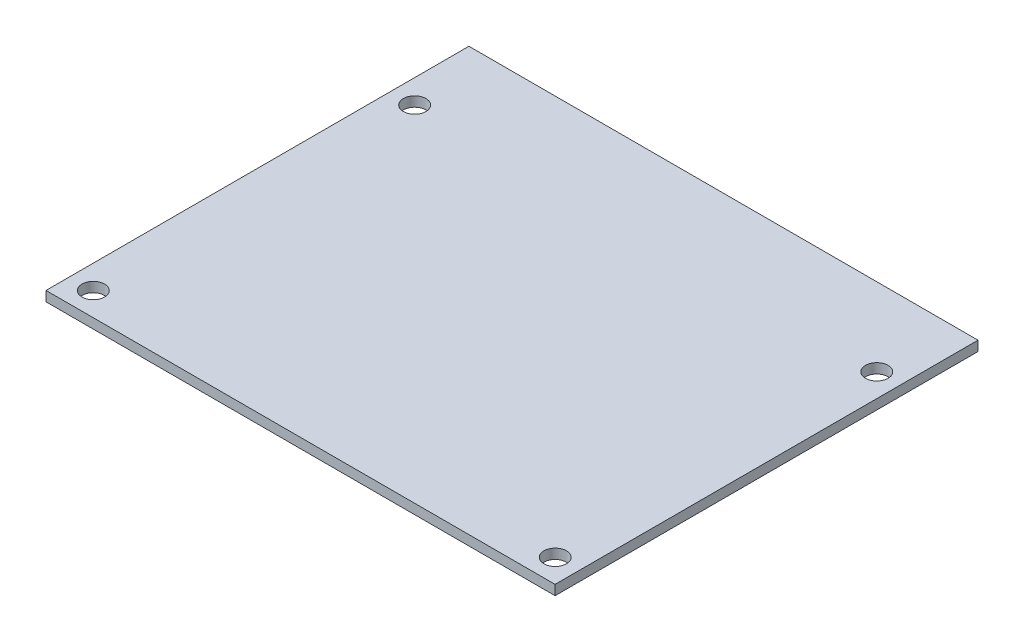
ISO-10303-21;
HEADER;
FILE_DESCRIPTION(('STEP AP214'),'2;1');
FILE_NAME('part.step','',(''),(''),'','','');
FILE_SCHEMA(('AUTOMOTIVE_DESIGN { 1 0 10303 214 1 1 1 1 }'));
ENDSEC;
DATA;
#1=APPLICATION_CONTEXT('core data for automotive mechanical design processes');
#2=APPLICATION_PROTOCOL_DEFINITION('international standard','automotive_design',2000,#1);
#3=PRODUCT_CONTEXT('',#1,'mechanical');
#4=PRODUCT('Part','Part','',(#3));
#5=PRODUCT_RELATED_PRODUCT_CATEGORY('part','',(#4));
#6=PRODUCT_DEFINITION_FORMATION('','',#4);
#7=PRODUCT_DEFINITION_CONTEXT('part definition',#1,'design');
#8=PRODUCT_DEFINITION('design','',#6,#7);
#9=PRODUCT_DEFINITION_SHAPE('','',#8);
#10=(LENGTH_UNIT() NAMED_UNIT(*) SI_UNIT(.MILLI.,.METRE.));
#11=(NAMED_UNIT(*) PLANE_ANGLE_UNIT() SI_UNIT($,.RADIAN.));
#12=(NAMED_UNIT(*) SI_UNIT($,.STERADIAN.) SOLID_ANGLE_UNIT());
#13=UNCERTAINTY_MEASURE_WITH_UNIT(LENGTH_MEASURE(1.E-05),#10,'distance_accuracy_value','');
#14=(GEOMETRIC_REPRESENTATION_CONTEXT(3) GLOBAL_UNCERTAINTY_ASSIGNED_CONTEXT((#13)) GLOBAL_UNIT_ASSIGNED_CONTEXT((#10,
#11,#12)) REPRESENTATION_CONTEXT('',''));
#15=CARTESIAN_POINT('',(0.,0.,0.));
#16=DIRECTION('',(0.,0.,1.));
#17=DIRECTION('',(1.,0.,0.));
#18=AXIS2_PLACEMENT_3D('',#15,#16,#17);
#19=CARTESIAN_POINT('',(41.275,1.6002,-34.29));
#20=DIRECTION('',(-1.,0.,0.));
#21=DIRECTION('',(0.,0.,1.));
#22=AXIS2_PLACEMENT_3D('',#19,#20,#21);
#23=PLANE('',#22);
#24=DIRECTION('',(0.,0.,-1.));
#25=VECTOR('',#24,1.);
#26=CARTESIAN_POINT('',(41.275,0.,-34.29));
#27=LINE('',#26,#25);
#28=CARTESIAN_POINT('',(41.275,0.,34.29));
#29=VERTEX_POINT('',#28);
#30=CARTESIAN_POINT('',(41.275,0.,-34.29));
#31=VERTEX_POINT('',#30);
#32=EDGE_CURVE('E100',#29,#31,#27,.T.);
#33=ORIENTED_EDGE('',*,*,#32,.T.);
#34=DIRECTION('',(0.,-1.,0.));
#35=VECTOR('',#34,1.);
#36=CARTESIAN_POINT('',(41.275,1.6002,-34.29));
#37=LINE('',#36,#35);
#38=CARTESIAN_POINT('',(41.275,1.6002,-34.29));
#39=VERTEX_POINT('',#38);
#40=EDGE_CURVE('E11',#39,#31,#37,.T.);
#41=ORIENTED_EDGE('',*,*,#40,.F.);
#42=DIRECTION('',(0.,0.,-1.));
#43=VECTOR('',#42,1.);
#44=CARTESIAN_POINT('',(41.275,1.6002,-34.29));
#45=LINE('',#44,#43);
#46=CARTESIAN_POINT('',(41.275,1.6002,34.29));
#47=VERTEX_POINT('',#46);
#48=EDGE_CURVE('E88',#47,#39,#45,.T.);
#49=ORIENTED_EDGE('',*,*,#48,.F.);
#50=DIRECTION('',(0.,-1.,0.));
#51=VECTOR('',#50,1.);
#52=CARTESIAN_POINT('',(41.275,1.6002,34.29));
#53=LINE('',#52,#51);
#54=EDGE_CURVE('E96',#47,#29,#53,.T.);
#55=ORIENTED_EDGE('',*,*,#54,.T.);
#56=EDGE_LOOP('',(#33,#41,#49,#55));
#57=FACE_BOUND('',#56,.T.);
#58=ADVANCED_FACE('F37',(#57),#23,.F.);
#59=CARTESIAN_POINT('',(-41.275,1.6002,-34.29));
#60=DIRECTION('',(0.,0.,1.));
#61=DIRECTION('',(1.,0.,0.));
#62=AXIS2_PLACEMENT_3D('',#59,#60,#61);
#63=PLANE('',#62);
#64=DIRECTION('',(-1.,0.,0.));
#65=VECTOR('',#64,1.);
#66=CARTESIAN_POINT('',(-41.275,0.,-34.29));
#67=LINE('',#66,#65);
#68=CARTESIAN_POINT('',(-41.275,0.,-34.29));
#69=VERTEX_POINT('',#68);
#70=EDGE_CURVE('E92',#31,#69,#67,.T.);
#71=ORIENTED_EDGE('',*,*,#70,.T.);
#72=DIRECTION('',(0.,-1.,0.));
#73=VECTOR('',#72,1.);
#74=CARTESIAN_POINT('',(-41.275,1.6002,-34.29));
#75=LINE('',#74,#73);
#76=CARTESIAN_POINT('',(-41.275,1.6002,-34.29));
#77=VERTEX_POINT('',#76);
#78=EDGE_CURVE('E45',#77,#69,#75,.T.);
#79=ORIENTED_EDGE('',*,*,#78,.F.);
#80=DIRECTION('',(-1.,0.,0.));
#81=VECTOR('',#80,1.);
#82=CARTESIAN_POINT('',(-41.275,1.6002,-34.29));
#83=LINE('',#82,#81);
#84=EDGE_CURVE('E83',#39,#77,#83,.T.);
#85=ORIENTED_EDGE('',*,*,#84,.F.);
#86=ORIENTED_EDGE('',*,*,#40,.T.);
#87=EDGE_LOOP('',(#71,#79,#85,#86));
#88=FACE_BOUND('',#87,.T.);
#89=ADVANCED_FACE('F91',(#88),#63,.F.);
#90=CARTESIAN_POINT('',(-41.275,1.6002,-34.29));
#91=DIRECTION('',(1.,0.,0.));
#92=DIRECTION('',(0.,0.,-1.));
#93=AXIS2_PLACEMENT_3D('',#90,#91,#92);
#94=PLANE('',#93);
#95=DIRECTION('',(0.,0.,1.));
#96=VECTOR('',#95,1.);
#97=CARTESIAN_POINT('',(-41.275,0.,-34.29));
#98=LINE('',#97,#96);
#99=CARTESIAN_POINT('',(-41.275,0.,34.29));
#100=VERTEX_POINT('',#99);
#101=EDGE_CURVE('E70',#69,#100,#98,.T.);
#102=ORIENTED_EDGE('',*,*,#101,.T.);
#103=DIRECTION('',(0.,-1.,0.));
#104=VECTOR('',#103,1.);
#105=CARTESIAN_POINT('',(-41.275,1.6002,34.29));
#106=LINE('',#105,#104);
#107=CARTESIAN_POINT('',(-41.275,1.6002,34.29));
#108=VERTEX_POINT('',#107);
#109=EDGE_CURVE('E93',#108,#100,#106,.T.);
#110=ORIENTED_EDGE('',*,*,#109,.F.);
#111=DIRECTION('',(0.,0.,1.));
#112=VECTOR('',#111,1.);
#113=CARTESIAN_POINT('',(-41.275,1.6002,-34.29));
#114=LINE('',#113,#112);
#115=EDGE_CURVE('E86',#77,#108,#114,.T.);
#116=ORIENTED_EDGE('',*,*,#115,.F.);
#117=ORIENTED_EDGE('',*,*,#78,.T.);
#118=EDGE_LOOP('',(#102,#110,#116,#117));
#119=FACE_BOUND('',#118,.T.);
#120=ADVANCED_FACE('F94',(#119),#94,.F.);
#121=CARTESIAN_POINT('',(-41.275,1.6002,34.29));
#122=DIRECTION('',(0.,0.,-1.));
#123=DIRECTION('',(-1.,0.,0.));
#124=AXIS2_PLACEMENT_3D('',#121,#122,#123);
#125=PLANE('',#124);
#126=DIRECTION('',(1.,0.,0.));
#127=VECTOR('',#126,1.);
#128=CARTESIAN_POINT('',(-41.275,0.,34.29));
#129=LINE('',#128,#127);
#130=EDGE_CURVE('E76',#100,#29,#129,.T.);
#131=ORIENTED_EDGE('',*,*,#130,.T.);
#132=ORIENTED_EDGE('',*,*,#54,.F.);
#133=DIRECTION('',(1.,0.,0.));
#134=VECTOR('',#133,1.);
#135=CARTESIAN_POINT('',(-41.275,1.6002,34.29));
#136=LINE('',#135,#134);
#137=EDGE_CURVE('E53',#108,#47,#136,.T.);
#138=ORIENTED_EDGE('',*,*,#137,.F.);
#139=ORIENTED_EDGE('',*,*,#109,.T.);
#140=EDGE_LOOP('',(#131,#132,#138,#139));
#141=FACE_BOUND('',#140,.T.);
#142=ADVANCED_FACE('F108',(#141),#125,.F.);
#143=CARTESIAN_POINT('',(0.,1.6002,0.));
#144=DIRECTION('',(0.,1.,0.));
#145=DIRECTION('',(0.,0.,1.));
#146=AXIS2_PLACEMENT_3D('',#143,#144,#145);
#147=PLANE('',#146);
#148=CARTESIAN_POINT('',(-37.4223549376644,1.6002,30.4698986613374));
#149=DIRECTION('',(0.,1.,0.));
#150=DIRECTION('',(0.,0.,1.));
#151=AXIS2_PLACEMENT_3D('',#148,#149,#150);
#152=CIRCLE('',#151,1.8288);
#153=CARTESIAN_POINT('',(-37.4223549376644,1.6002,32.2986986613374));
#154=VERTEX_POINT('',#153);
#155=EDGE_CURVE('E132',#154,#154,#152,.T.);
#156=ORIENTED_EDGE('',*,*,#155,.F.);
#157=EDGE_LOOP('',(#156));
#158=FACE_BOUND('',#157,.T.);
#159=CARTESIAN_POINT('',(-37.4223549376644,1.6002,-21.6352322251794));
#160=DIRECTION('',(0.,1.,0.));
#161=DIRECTION('',(0.,0.,1.));
#162=AXIS2_PLACEMENT_3D('',#159,#160,#161);
#163=CIRCLE('',#162,1.8288);
#164=CARTESIAN_POINT('',(-37.4223549376644,1.6002,-19.8064322251794));
#165=VERTEX_POINT('',#164);
#166=EDGE_CURVE('E126',#165,#165,#163,.T.);
#167=ORIENTED_EDGE('',*,*,#166,.F.);
#168=EDGE_LOOP('',(#167));
#169=FACE_BOUND('',#168,.T.);
#170=CARTESIAN_POINT('',(37.5134275848108,1.6002,-21.6352322251794));
#171=DIRECTION('',(0.,1.,0.));
#172=DIRECTION('',(0.,0.,1.));
#173=AXIS2_PLACEMENT_3D('',#170,#171,#172);
#174=CIRCLE('',#173,1.8288);
#175=CARTESIAN_POINT('',(37.5134275848108,1.6002,-19.8064322251794));
#176=VERTEX_POINT('',#175);
#177=EDGE_CURVE('E120',#176,#176,#174,.T.);
#178=ORIENTED_EDGE('',*,*,#177,.F.);
#179=EDGE_LOOP('',(#178));
#180=FACE_BOUND('',#179,.T.);
#181=CARTESIAN_POINT('',(37.4881896451171,1.6002,30.4836627554579));
#182=DIRECTION('',(0.,1.,0.));
#183=DIRECTION('',(0.,0.,1.));
#184=AXIS2_PLACEMENT_3D('',#181,#182,#183);
#185=CIRCLE('',#184,1.8288);
#186=CARTESIAN_POINT('',(37.4881896451171,1.6002,32.3124627554579));
#187=VERTEX_POINT('',#186);
#188=EDGE_CURVE('E114',#187,#187,#185,.T.);
#189=ORIENTED_EDGE('',*,*,#188,.F.);
#190=EDGE_LOOP('',(#189));
#191=FACE_BOUND('',#190,.T.);
#192=ORIENTED_EDGE('',*,*,#48,.T.);
#193=ORIENTED_EDGE('',*,*,#84,.T.);
#194=ORIENTED_EDGE('',*,*,#115,.T.);
#195=ORIENTED_EDGE('',*,*,#137,.T.);
#196=EDGE_LOOP('',(#192,#193,#194,#195));
#197=FACE_BOUND('',#196,.T.);
#198=ADVANCED_FACE('F84',(#158,#169,#180,#191,#197),#147,.T.);
#199=CARTESIAN_POINT('',(0.,0.,0.));
#200=DIRECTION('',(0.,1.,0.));
#201=DIRECTION('',(0.,0.,1.));
#202=AXIS2_PLACEMENT_3D('',#199,#200,#201);
#203=PLANE('',#202);
#204=CARTESIAN_POINT('',(-37.4223549376644,0.,30.4698986613374));
#205=DIRECTION('',(0.,1.,0.));
#206=DIRECTION('',(0.,0.,1.));
#207=AXIS2_PLACEMENT_3D('',#204,#205,#206);
#208=CIRCLE('',#207,1.8288);
#209=CARTESIAN_POINT('',(-37.4223549376644,0.,32.2986986613374));
#210=VERTEX_POINT('',#209);
#211=EDGE_CURVE('E129',#210,#210,#208,.T.);
#212=ORIENTED_EDGE('',*,*,#211,.T.);
#213=EDGE_LOOP('',(#212));
#214=FACE_BOUND('',#213,.T.);
#215=CARTESIAN_POINT('',(-37.4223549376644,0.,-21.6352322251794));
#216=DIRECTION('',(0.,1.,0.));
#217=DIRECTION('',(0.,0.,1.));
#218=AXIS2_PLACEMENT_3D('',#215,#216,#217);
#219=CIRCLE('',#218,1.8288);
#220=CARTESIAN_POINT('',(-37.4223549376644,0.,-19.8064322251794));
#221=VERTEX_POINT('',#220);
#222=EDGE_CURVE('E123',#221,#221,#219,.T.);
#223=ORIENTED_EDGE('',*,*,#222,.T.);
#224=EDGE_LOOP('',(#223));
#225=FACE_BOUND('',#224,.T.);
#226=CARTESIAN_POINT('',(37.5134275848108,0.,-21.6352322251794));
#227=DIRECTION('',(0.,1.,0.));
#228=DIRECTION('',(0.,0.,1.));
#229=AXIS2_PLACEMENT_3D('',#226,#227,#228);
#230=CIRCLE('',#229,1.8288);
#231=CARTESIAN_POINT('',(37.5134275848108,0.,-19.8064322251794));
#232=VERTEX_POINT('',#231);
#233=EDGE_CURVE('E117',#232,#232,#230,.T.);
#234=ORIENTED_EDGE('',*,*,#233,.T.);
#235=EDGE_LOOP('',(#234));
#236=FACE_BOUND('',#235,.T.);
#237=CARTESIAN_POINT('',(37.4881896451171,0.,30.4836627554579));
#238=DIRECTION('',(0.,1.,0.));
#239=DIRECTION('',(0.,0.,1.));
#240=AXIS2_PLACEMENT_3D('',#237,#238,#239);
#241=CIRCLE('',#240,1.8288);
#242=CARTESIAN_POINT('',(37.4881896451171,0.,32.3124627554579));
#243=VERTEX_POINT('',#242);
#244=EDGE_CURVE('E103',#243,#243,#241,.T.);
#245=ORIENTED_EDGE('',*,*,#244,.T.);
#246=EDGE_LOOP('',(#245));
#247=FACE_BOUND('',#246,.T.);
#248=ORIENTED_EDGE('',*,*,#32,.F.);
#249=ORIENTED_EDGE('',*,*,#130,.F.);
#250=ORIENTED_EDGE('',*,*,#101,.F.);
#251=ORIENTED_EDGE('',*,*,#70,.F.);
#252=EDGE_LOOP('',(#248,#249,#250,#251));
#253=FACE_BOUND('',#252,.T.);
#254=ADVANCED_FACE('F111',(#214,#225,#236,#247,#253),#203,.F.);
#255=CARTESIAN_POINT('',(37.4881896451171,0.,30.4836627554579));
#256=DIRECTION('',(0.,1.,0.));
#257=DIRECTION('',(0.,0.,1.));
#258=AXIS2_PLACEMENT_3D('',#255,#256,#257);
#259=CYLINDRICAL_SURFACE('',#258,1.8288);
#260=ORIENTED_EDGE('',*,*,#244,.F.);
#261=EDGE_LOOP('',(#260));
#262=FACE_BOUND('',#261,.T.);
#263=ORIENTED_EDGE('',*,*,#188,.T.);
#264=EDGE_LOOP('',(#263));
#265=FACE_BOUND('',#264,.T.);
#266=ADVANCED_FACE('F156',(#262,#265),#259,.F.);
#267=CARTESIAN_POINT('',(37.5134275848108,0.,-21.6352322251794));
#268=DIRECTION('',(0.,1.,0.));
#269=DIRECTION('',(0.,0.,1.));
#270=AXIS2_PLACEMENT_3D('',#267,#268,#269);
#271=CYLINDRICAL_SURFACE('',#270,1.8288);
#272=ORIENTED_EDGE('',*,*,#233,.F.);
#273=EDGE_LOOP('',(#272));
#274=FACE_BOUND('',#273,.T.);
#275=ORIENTED_EDGE('',*,*,#177,.T.);
#276=EDGE_LOOP('',(#275));
#277=FACE_BOUND('',#276,.T.);
#278=ADVANCED_FACE('F158',(#274,#277),#271,.F.);
#279=CARTESIAN_POINT('',(-37.4223549376644,0.,-21.6352322251794));
#280=DIRECTION('',(0.,1.,0.));
#281=DIRECTION('',(0.,0.,1.));
#282=AXIS2_PLACEMENT_3D('',#279,#280,#281);
#283=CYLINDRICAL_SURFACE('',#282,1.8288);
#284=ORIENTED_EDGE('',*,*,#222,.F.);
#285=EDGE_LOOP('',(#284));
#286=FACE_BOUND('',#285,.T.);
#287=ORIENTED_EDGE('',*,*,#166,.T.);
#288=EDGE_LOOP('',(#287));
#289=FACE_BOUND('',#288,.T.);
#290=ADVANCED_FACE('F143',(#286,#289),#283,.F.);
#291=CARTESIAN_POINT('',(-37.4223549376644,0.,30.4698986613374));
#292=DIRECTION('',(0.,1.,0.));
#293=DIRECTION('',(0.,0.,1.));
#294=AXIS2_PLACEMENT_3D('',#291,#292,#293);
#295=CYLINDRICAL_SURFACE('',#294,1.8288);
#296=ORIENTED_EDGE('',*,*,#211,.F.);
#297=EDGE_LOOP('',(#296));
#298=FACE_BOUND('',#297,.T.);
#299=ORIENTED_EDGE('',*,*,#155,.T.);
#300=EDGE_LOOP('',(#299));
#301=FACE_BOUND('',#300,.T.);
#302=ADVANCED_FACE('F140',(#298,#301),#295,.F.);
#303=CLOSED_SHELL('',(#58,#89,#120,#142,#198,#254,#266,#278,#290,#302));
#304=MANIFOLD_SOLID_BREP('B2',#303);
#305=ADVANCED_BREP_SHAPE_REPRESENTATION('',(#18,#304),#14);
#306=SHAPE_DEFINITION_REPRESENTATION(#9,#305);
ENDSEC;
END-ISO-10303-21;
